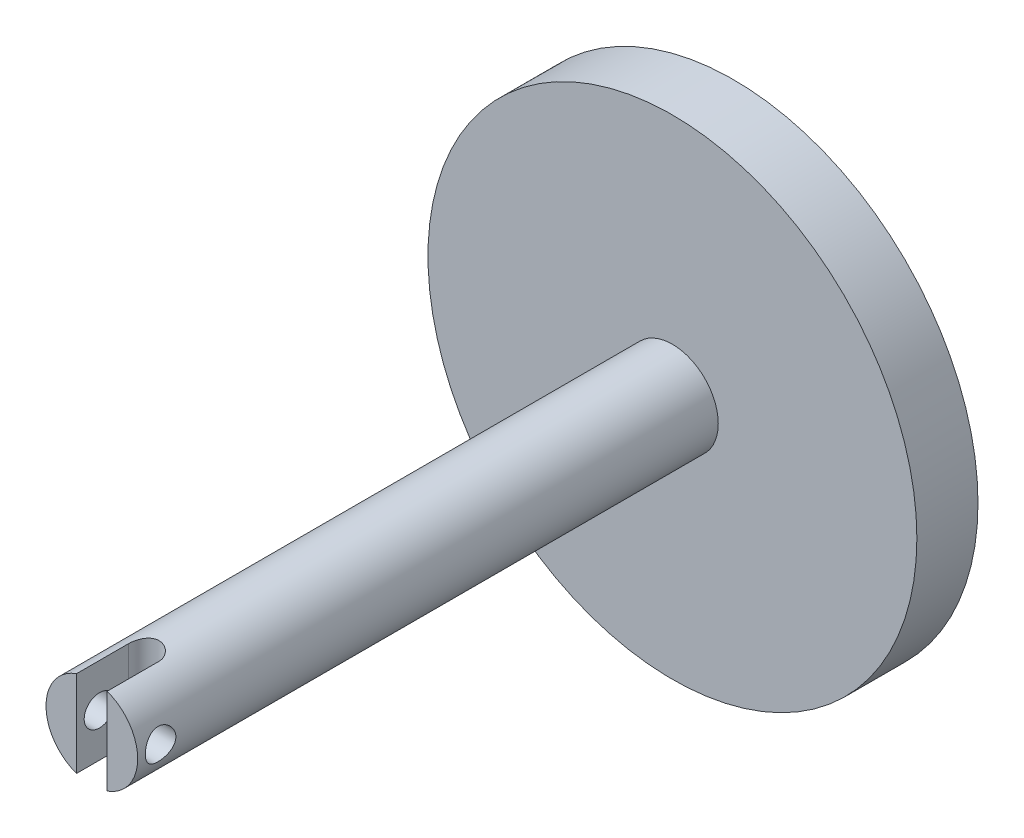
ISO-10303-21;
HEADER;
FILE_DESCRIPTION(('STEP AP214'),'2;1');
FILE_NAME('part.step','',(''),(''),'','','');
FILE_SCHEMA(('AUTOMOTIVE_DESIGN { 1 0 10303 214 1 1 1 1 }'));
ENDSEC;
DATA;
#1=APPLICATION_CONTEXT('core data for automotive mechanical design processes');
#2=APPLICATION_PROTOCOL_DEFINITION('international standard','automotive_design',2000,#1);
#3=PRODUCT_CONTEXT('',#1,'mechanical');
#4=PRODUCT('Part','Part','',(#3));
#5=PRODUCT_RELATED_PRODUCT_CATEGORY('part','',(#4));
#6=PRODUCT_DEFINITION_FORMATION('','',#4);
#7=PRODUCT_DEFINITION_CONTEXT('part definition',#1,'design');
#8=PRODUCT_DEFINITION('design','',#6,#7);
#9=PRODUCT_DEFINITION_SHAPE('','',#8);
#10=(LENGTH_UNIT() NAMED_UNIT(*) SI_UNIT(.MILLI.,.METRE.));
#11=(NAMED_UNIT(*) PLANE_ANGLE_UNIT() SI_UNIT($,.RADIAN.));
#12=(NAMED_UNIT(*) SI_UNIT($,.STERADIAN.) SOLID_ANGLE_UNIT());
#13=UNCERTAINTY_MEASURE_WITH_UNIT(LENGTH_MEASURE(1.E-05),#10,'distance_accuracy_value','');
#14=(GEOMETRIC_REPRESENTATION_CONTEXT(3) GLOBAL_UNCERTAINTY_ASSIGNED_CONTEXT((#13)) GLOBAL_UNIT_ASSIGNED_CONTEXT((#10,
#11,#12)) REPRESENTATION_CONTEXT('',''));
#15=CARTESIAN_POINT('',(0.,0.,0.));
#16=DIRECTION('',(0.,0.,1.));
#17=DIRECTION('',(1.,0.,0.));
#18=AXIS2_PLACEMENT_3D('',#15,#16,#17);
#19=CARTESIAN_POINT('',(0.,0.,105.));
#20=DIRECTION('',(0.,0.,-1.));
#21=DIRECTION('',(-1.,0.,0.));
#22=AXIS2_PLACEMENT_3D('',#19,#20,#21);
#23=CYLINDRICAL_SURFACE('',#22,7.5);
#24=CARTESIAN_POINT('',(0.,0.,105.));
#25=DIRECTION('',(0.,0.,1.));
#26=DIRECTION('',(1.,0.,0.));
#27=AXIS2_PLACEMENT_3D('',#24,#25,#26);
#28=CIRCLE('',#27,7.5);
#29=CARTESIAN_POINT('',(2.5,-7.07106781186548,105.));
#30=VERTEX_POINT('',#29);
#31=CARTESIAN_POINT('',(2.5,7.07106781186548,105.));
#32=VERTEX_POINT('',#31);
#33=EDGE_CURVE('E306',#30,#32,#28,.T.);
#34=ORIENTED_EDGE('',*,*,#33,.F.);
#35=DIRECTION('',(0.,0.,-1.));
#36=VECTOR('',#35,1.);
#37=CARTESIAN_POINT('',(2.5,-7.07106781186548,105.));
#38=LINE('',#37,#36);
#39=CARTESIAN_POINT('',(2.5,-7.07106781186548,96.5));
#40=VERTEX_POINT('',#39);
#41=EDGE_CURVE('E96',#30,#40,#38,.T.);
#42=ORIENTED_EDGE('',*,*,#41,.T.);
#43=CARTESIAN_POINT('',(2.5,-7.07106781186548,96.5));
#44=CARTESIAN_POINT('',(2.50000899110405,-7.07105693273157,96.4317929221797));
#45=CARTESIAN_POINT('',(2.49720887221585,-7.07205443904569,96.3635919253246));
#46=CARTESIAN_POINT('',(2.4860604578047,-7.07598524121007,96.2277189616508));
#47=CARTESIAN_POINT('',(2.47771365997202,-7.07891801450642,96.160046857012));
#48=CARTESIAN_POINT('',(2.45557459422795,-7.08662705252507,96.0259095116455));
#49=CARTESIAN_POINT('',(2.44179847763136,-7.09139784850118,95.9594412974491));
#50=CARTESIAN_POINT('',(2.4089418103012,-7.10262619906002,95.8279917314172));
#51=CARTESIAN_POINT('',(2.38986106786032,-7.10908381460331,95.7630104334101));
#52=CARTESIAN_POINT('',(2.32491551306196,-7.13069940793912,95.5710384202854));
#53=CARTESIAN_POINT('',(2.2713141681025,-7.14811243884051,95.44682084253));
#54=CARTESIAN_POINT('',(2.14517784106255,-7.1869703408752,95.2091231885366));
#55=CARTESIAN_POINT('',(2.07263123268532,-7.20841768551077,95.0956497642198));
#56=CARTESIAN_POINT('',(1.90762995846819,-7.25386182389479,94.8782070965292));
#57=CARTESIAN_POINT('',(1.81456284630833,-7.27792189428067,94.7747148572318));
#58=CARTESIAN_POINT('',(1.61247071190513,-7.32534626726038,94.5844828967663));
#59=CARTESIAN_POINT('',(1.50344285413658,-7.34871044533518,94.497746158681));
#60=CARTESIAN_POINT('',(1.26900922493972,-7.39284706096344,94.3413017757375));
#61=CARTESIAN_POINT('',(1.14325025284461,-7.41353593532888,94.2720976922578));
#62=CARTESIAN_POINT('',(0.881073095475287,-7.44924021883279,94.1560192175653));
#63=CARTESIAN_POINT('',(0.744658181225879,-7.46425736081204,94.1091380050743));
#64=CARTESIAN_POINT('',(0.470073371182902,-7.48647677762783,94.0406607237418));
#65=CARTESIAN_POINT('',(0.332129588153738,-7.49393272446142,94.0182418290428));
#66=CARTESIAN_POINT('',(0.0542474216361972,-7.50109021034827,93.9967092432615));
#67=CARTESIAN_POINT('',(-0.0856904786402172,-7.50079359709905,93.9975899990842));
#68=CARTESIAN_POINT('',(-0.357759612692405,-7.49265096581776,94.0221107104005));
#69=CARTESIAN_POINT('',(-0.489981756428175,-7.48510152476447,94.0448565956047));
#70=CARTESIAN_POINT('',(-0.748610161077314,-7.46367401253772,94.1109829959792));
#71=CARTESIAN_POINT('',(-0.875016099077739,-7.44979559044789,94.1543646553253));
#72=CARTESIAN_POINT('',(-1.12038155754035,-7.41689170677793,94.2610534241945));
#73=CARTESIAN_POINT('',(-1.23922126412503,-7.39780094595656,94.3246151128576));
#74=CARTESIAN_POINT('',(-1.46481147275367,-7.35645969200236,94.469649878425));
#75=CARTESIAN_POINT('',(-1.57155867428943,-7.33420833994017,94.5511278276021));
#76=CARTESIAN_POINT('',(-1.77524334927518,-7.28765679856813,94.734177625007));
#77=CARTESIAN_POINT('',(-1.87148402903098,-7.26330946699776,94.8365138590282));
#78=CARTESIAN_POINT('',(-2.04568006205172,-7.21618726182138,95.0561037242864));
#79=CARTESIAN_POINT('',(-2.12362950795974,-7.19341289789386,95.173362156007));
#80=CARTESIAN_POINT('',(-2.26000831398175,-7.15175078440791,95.4217004458843));
#81=CARTESIAN_POINT('',(-2.31813252376915,-7.13292537370586,95.5529587873327));
#82=CARTESIAN_POINT('',(-2.41115057675285,-7.10202742655098,95.8241174439746));
#83=CARTESIAN_POINT('',(-2.4460810901384,-7.08994423522482,95.9640037334303));
#84=CARTESIAN_POINT('',(-2.47914539070206,-7.078413552368,96.17104659187));
#85=CARTESIAN_POINT('',(-2.48696265313778,-7.07566669236505,96.2366034746356));
#86=CARTESIAN_POINT('',(-2.49738654017799,-7.07199258928497,96.3680951959995));
#87=CARTESIAN_POINT('',(-2.49999988848745,-7.0710629982382,96.434029436361));
#88=CARTESIAN_POINT('',(-2.5,-7.07106781186548,96.5));
#89=B_SPLINE_CURVE_WITH_KNOTS('',3,(#43,#44,#45,#46,#47,#48,#49,#50,#51,#52,#53,#54,#55,#56,#57,
#58,#59,#60,#61,#62,#63,#64,#65,#66,#67,#68,#69,#70,#71,#72,#73,#74,#75,#76,#77,#78,#79,#80,#81,
#82,#83,#84,#85,#86,#87,#88),.UNSPECIFIED.,.F.,.F.,(4,2,2,2,2,2,2,2,2,2,2,2,2,2,2,2,2,2,2,2,2,2,
4),(0.,0.204546211838573,0.409037215423635,0.61292442942907,0.816819012805388,1.22401016923255,
1.63145179965522,2.05327864088388,2.47518051341063,2.90809434014448,3.34087579484514,
3.75860278500203,4.17623021758301,4.57747647846033,4.97874498952315,5.38529148746615,
5.79194868153616,6.2177173682682,6.64362337304802,7.07581676501795,7.50732520398793,
7.70536340013573,7.90314555504336),.UNSPECIFIED.);
#90=CARTESIAN_POINT('',(-2.5,-7.07106781186548,96.5));
#91=VERTEX_POINT('',#90);
#92=EDGE_CURVE('E84',#40,#91,#89,.T.);
#93=ORIENTED_EDGE('',*,*,#92,.T.);
#94=DIRECTION('',(0.,0.,-1.));
#95=VECTOR('',#94,1.);
#96=CARTESIAN_POINT('',(-2.5,-7.07106781186548,105.));
#97=LINE('',#96,#95);
#98=CARTESIAN_POINT('',(-2.5,-7.07106781186548,105.));
#99=VERTEX_POINT('',#98);
#100=EDGE_CURVE('E90',#91,#99,#97,.F.);
#101=ORIENTED_EDGE('',*,*,#100,.T.);
#102=CARTESIAN_POINT('',(-2.5,7.07106781186548,105.));
#103=VERTEX_POINT('',#102);
#104=EDGE_CURVE('E301',#103,#99,#28,.T.);
#105=ORIENTED_EDGE('',*,*,#104,.F.);
#106=DIRECTION('',(0.,0.,-1.));
#107=VECTOR('',#106,1.);
#108=CARTESIAN_POINT('',(-2.5,7.07106781186548,105.));
#109=LINE('',#108,#107);
#110=CARTESIAN_POINT('',(-2.5,7.07106781186548,96.5));
#111=VERTEX_POINT('',#110);
#112=EDGE_CURVE('E62',#111,#103,#109,.F.);
#113=ORIENTED_EDGE('',*,*,#112,.F.);
#114=CARTESIAN_POINT('',(2.5,7.07106781186548,96.5));
#115=CARTESIAN_POINT('',(2.50000899110405,7.07105693273157,96.4317929221797));
#116=CARTESIAN_POINT('',(2.49720887221585,7.07205443904569,96.3635919253246));
#117=CARTESIAN_POINT('',(2.4860604578047,7.07598524121007,96.2277189616508));
#118=CARTESIAN_POINT('',(2.47771365997202,7.07891801450642,96.160046857012));
#119=CARTESIAN_POINT('',(2.45557459422795,7.08662705252507,96.0259095116455));
#120=CARTESIAN_POINT('',(2.44179847763136,7.09139784850118,95.9594412974491));
#121=CARTESIAN_POINT('',(2.4089418103012,7.10262619906002,95.8279917314172));
#122=CARTESIAN_POINT('',(2.38986106786032,7.10908381460331,95.7630104334101));
#123=CARTESIAN_POINT('',(2.32491551306196,7.13069940793912,95.5710384202854));
#124=CARTESIAN_POINT('',(2.2713141681025,7.14811243884051,95.44682084253));
#125=CARTESIAN_POINT('',(2.14517784106255,7.1869703408752,95.2091231885366));
#126=CARTESIAN_POINT('',(2.07263123268532,7.20841768551077,95.0956497642198));
#127=CARTESIAN_POINT('',(1.90762995846819,7.25386182389479,94.8782070965292));
#128=CARTESIAN_POINT('',(1.81456284630833,7.27792189428067,94.7747148572318));
#129=CARTESIAN_POINT('',(1.61247071190513,7.32534626726038,94.5844828967663));
#130=CARTESIAN_POINT('',(1.50344285413658,7.34871044533518,94.497746158681));
#131=CARTESIAN_POINT('',(1.26900922493972,7.39284706096344,94.3413017757375));
#132=CARTESIAN_POINT('',(1.14325025284461,7.41353593532888,94.2720976922578));
#133=CARTESIAN_POINT('',(0.881073095475287,7.44924021883279,94.1560192175653));
#134=CARTESIAN_POINT('',(0.744658181225879,7.46425736081204,94.1091380050743));
#135=CARTESIAN_POINT('',(0.470073371182902,7.48647677762783,94.0406607237418));
#136=CARTESIAN_POINT('',(0.332129588153738,7.49393272446142,94.0182418290428));
#137=CARTESIAN_POINT('',(0.0542474216361972,7.50109021034827,93.9967092432615));
#138=CARTESIAN_POINT('',(-0.0856904786402172,7.50079359709905,93.9975899990842));
#139=CARTESIAN_POINT('',(-0.357759612692405,7.49265096581776,94.0221107104005));
#140=CARTESIAN_POINT('',(-0.489981756428175,7.48510152476447,94.0448565956047));
#141=CARTESIAN_POINT('',(-0.748610161077314,7.46367401253772,94.1109829959792));
#142=CARTESIAN_POINT('',(-0.875016099077739,7.44979559044789,94.1543646553253));
#143=CARTESIAN_POINT('',(-1.12038155754035,7.41689170677793,94.2610534241945));
#144=CARTESIAN_POINT('',(-1.23922126412503,7.39780094595656,94.3246151128576));
#145=CARTESIAN_POINT('',(-1.46481147275367,7.35645969200236,94.469649878425));
#146=CARTESIAN_POINT('',(-1.57155867428943,7.33420833994017,94.5511278276021));
#147=CARTESIAN_POINT('',(-1.77524334927518,7.28765679856813,94.734177625007));
#148=CARTESIAN_POINT('',(-1.87148402903098,7.26330946699776,94.8365138590282));
#149=CARTESIAN_POINT('',(-2.04568006205172,7.21618726182138,95.0561037242864));
#150=CARTESIAN_POINT('',(-2.12362950795974,7.19341289789386,95.173362156007));
#151=CARTESIAN_POINT('',(-2.26000831398175,7.15175078440791,95.4217004458843));
#152=CARTESIAN_POINT('',(-2.31813252376915,7.13292537370586,95.5529587873327));
#153=CARTESIAN_POINT('',(-2.41115057675285,7.10202742655098,95.8241174439746));
#154=CARTESIAN_POINT('',(-2.4460810901384,7.08994423522482,95.9640037334303));
#155=CARTESIAN_POINT('',(-2.47914539070206,7.078413552368,96.17104659187));
#156=CARTESIAN_POINT('',(-2.48696265313778,7.07566669236505,96.2366034746356));
#157=CARTESIAN_POINT('',(-2.49738654017799,7.07199258928497,96.3680951959995));
#158=CARTESIAN_POINT('',(-2.49999988848745,7.0710629982382,96.434029436361));
#159=CARTESIAN_POINT('',(-2.5,7.07106781186548,96.5));
#160=B_SPLINE_CURVE_WITH_KNOTS('',3,(#114,#115,#116,#117,#118,#119,#120,#121,#122,#123,#124,
#125,#126,#127,#128,#129,#130,#131,#132,#133,#134,#135,#136,#137,#138,#139,#140,#141,#142,#143,
#144,#145,#146,#147,#148,#149,#150,#151,#152,#153,#154,#155,#156,#157,#158,#159),.UNSPECIFIED.,
.F.,.F.,(4,2,2,2,2,2,2,2,2,2,2,2,2,2,2,2,2,2,2,2,2,2,4),(0.,0.204546211838573,0.409037215423635,
0.61292442942907,0.816819012805388,1.22401016923255,1.63145179965522,2.05327864088388,
2.47518051341063,2.90809434014448,3.34087579484514,3.75860278500203,4.17623021758301,
4.57747647846033,4.97874498952315,5.38529148746615,5.79194868153616,6.2177173682682,
6.64362337304802,7.07581676501795,7.50732520398793,7.70536340013573,7.90314555504336),.UNSPECIFIED.);
#161=CARTESIAN_POINT('',(2.5,7.07106781186548,96.5));
#162=VERTEX_POINT('',#161);
#163=EDGE_CURVE('E49',#162,#111,#160,.T.);
#164=ORIENTED_EDGE('',*,*,#163,.F.);
#165=DIRECTION('',(0.,0.,-1.));
#166=VECTOR('',#165,1.);
#167=CARTESIAN_POINT('',(2.5,7.07106781186548,105.));
#168=LINE('',#167,#166);
#169=EDGE_CURVE('E86',#32,#162,#168,.T.);
#170=ORIENTED_EDGE('',*,*,#169,.F.);
#171=EDGE_LOOP('',(#34,#42,#93,#101,#105,#113,#164,#170));
#172=FACE_BOUND('',#171,.T.);
#173=CARTESIAN_POINT('',(0.,0.,10.));
#174=DIRECTION('',(0.,0.,1.));
#175=DIRECTION('',(1.,0.,0.));
#176=AXIS2_PLACEMENT_3D('',#173,#174,#175);
#177=CIRCLE('',#176,7.5);
#178=CARTESIAN_POINT('',(7.5,0.,10.));
#179=VERTEX_POINT('',#178);
#180=EDGE_CURVE('E310',#179,#179,#177,.T.);
#181=ORIENTED_EDGE('',*,*,#180,.T.);
#182=EDGE_LOOP('',(#181));
#183=FACE_BOUND('',#182,.T.);
#184=CARTESIAN_POINT('',(-7.5,0.,103.75));
#185=CARTESIAN_POINT('',(-7.5000003825236,-0.136408407216808,103.750000634329));
#186=CARTESIAN_POINT('',(-7.49624423768862,-0.272812986346375,103.738799334682));
#187=CARTESIAN_POINT('',(-7.48163025508202,-0.541604402182431,103.694427227957));
#188=CARTESIAN_POINT('',(-7.47077168005381,-0.673990820297045,103.661254140128));
#189=CARTESIAN_POINT('',(-7.44313269766107,-0.930831973754441,103.57420189154));
#190=CARTESIAN_POINT('',(-7.42636219327133,-1.05529956471509,103.520357343852));
#191=CARTESIAN_POINT('',(-7.38861114293355,-1.29343734201331,103.393647067904));
#192=CARTESIAN_POINT('',(-7.36762976669445,-1.40710539239676,103.320777587493));
#193=CARTESIAN_POINT('',(-7.32285236107513,-1.62435418755566,103.155435487853));
#194=CARTESIAN_POINT('',(-7.29898891159462,-1.72750925074577,103.062421914349));
#195=CARTESIAN_POINT('',(-7.25150786957804,-1.91708173175521,102.860582113234));
#196=CARTESIAN_POINT('',(-7.22789033226373,-2.00349546372365,102.751752412679));
#197=CARTESIAN_POINT('',(-7.18283331193184,-2.15956235556965,102.517537212009));
#198=CARTESIAN_POINT('',(-7.1614759818922,-2.22866214555258,102.39176565067));
#199=CARTESIAN_POINT('',(-7.12438263546503,-2.3445471846943,102.129559763854));
#200=CARTESIAN_POINT('',(-7.10864490401864,-2.39133924346691,101.993128707093));
#201=CARTESIAN_POINT('',(-7.08528258173443,-2.4596836537729,101.718316946258));
#202=CARTESIAN_POINT('',(-7.07740239424028,-2.48203362067942,101.580156978777));
#203=CARTESIAN_POINT('',(-7.06989141573769,-2.50335280833619,101.30184061461));
#204=CARTESIAN_POINT('',(-7.07025807556825,-2.50232925401179,101.161684848227));
#205=CARTESIAN_POINT('',(-7.0789753752045,-2.47754975925854,100.89015842389));
#206=CARTESIAN_POINT('',(-7.08696039668832,-2.45483478291748,100.758678992702));
#207=CARTESIAN_POINT('',(-7.10941644311377,-2.38901540712353,100.501516450983));
#208=CARTESIAN_POINT('',(-7.12388824460269,-2.34590856647967,100.375834036412));
#209=CARTESIAN_POINT('',(-7.15794777828122,-2.23984764515052,100.131468126021));
#210=CARTESIAN_POINT('',(-7.17761414482794,-2.17658512176815,100.012929936326));
#211=CARTESIAN_POINT('',(-7.21981396439316,-2.03222276575783,99.7878227293007));
#212=CARTESIAN_POINT('',(-7.24234824476159,-1.95111778091,99.6812571826665));
#213=CARTESIAN_POINT('',(-7.28918322919353,-1.76837333170558,99.4772710045981));
#214=CARTESIAN_POINT('',(-7.31351473387107,-1.66588287519076,99.3806182637273));
#215=CARTESIAN_POINT('',(-7.36017345967592,-1.44584892492515,99.2056718333415));
#216=CARTESIAN_POINT('',(-7.38250048845168,-1.32830398915203,99.1273799045888));
#217=CARTESIAN_POINT('',(-7.42292769844484,-1.07986903261567,98.9907592494123));
#218=CARTESIAN_POINT('',(-7.44098375020098,-0.948858191040841,98.9326362716482));
#219=CARTESIAN_POINT('',(-7.47051417861087,-0.678172708411268,98.8394920651107));
#220=CARTESIAN_POINT('',(-7.48199084137198,-0.538501095387383,98.8044628114414));
#221=CARTESIAN_POINT('',(-7.49669067678601,-0.260959573823258,98.7598608349441));
#222=CARTESIAN_POINT('',(-7.5002500458432,-0.123273999662114,98.7492504770681));
#223=CARTESIAN_POINT('',(-7.49972256737068,0.151937674900594,98.7508316839962));
#224=CARTESIAN_POINT('',(-7.49563701048406,0.289463798299127,98.7630193999497));
#225=CARTESIAN_POINT('',(-7.48050061792761,0.556299665760638,98.8090297693399));
#226=CARTESIAN_POINT('',(-7.46965496777981,0.685732017087106,98.8422155151237));
#227=CARTESIAN_POINT('',(-7.44229617075175,0.937139896448931,98.9284836111668));
#228=CARTESIAN_POINT('',(-7.42578230116688,1.05911447127151,98.9815684986695));
#229=CARTESIAN_POINT('',(-7.38822328218224,1.29572074098318,99.107676079602));
#230=CARTESIAN_POINT('',(-7.36707036889465,1.41007489804286,99.1811864832079));
#231=CARTESIAN_POINT('',(-7.32263134790656,1.62516207533896,99.3454853750337));
#232=CARTESIAN_POINT('',(-7.29934458984569,1.72589091948894,99.4362791400794));
#233=CARTESIAN_POINT('',(-7.25192119951112,1.91563126951575,99.6374468775165));
#234=CARTESIAN_POINT('',(-7.2277940271857,2.00390242311442,99.7485230673171));
#235=CARTESIAN_POINT('',(-7.18249933236772,2.16064380580893,99.9844289195272));
#236=CARTESIAN_POINT('',(-7.16133183455006,2.22911386982753,100.109258696585));
#237=CARTESIAN_POINT('',(-7.12455979478459,2.3439923260409,100.369182538225));
#238=CARTESIAN_POINT('',(-7.10894401982447,2.39044533041255,100.504255197922));
#239=CARTESIAN_POINT('',(-7.08527080766124,2.45973666689838,100.78094662511));
#240=CARTESIAN_POINT('',(-7.07720996559099,2.48258563738484,100.922562413511));
#241=CARTESIAN_POINT('',(-7.06994647185443,2.50319070619335,101.200492740102));
#242=CARTESIAN_POINT('',(-7.07031000643538,2.50217564327099,101.336705850717));
#243=CARTESIAN_POINT('',(-7.07878174559669,2.47810573362173,101.606912687305));
#244=CARTESIAN_POINT('',(-7.08688948923404,2.45505219864646,101.740906544888));
#245=CARTESIAN_POINT('',(-7.10961310762229,2.38842953282336,102.000339157506));
#246=CARTESIAN_POINT('',(-7.12410245056194,2.34525836503878,102.125892062511));
#247=CARTESIAN_POINT('',(-7.15790997046171,2.23994841439936,102.368068517346));
#248=CARTESIAN_POINT('',(-7.17722921908483,2.1778054213845,102.48469007797));
#249=CARTESIAN_POINT('',(-7.21957073065116,2.03315173145856,102.711209174807));
#250=CARTESIAN_POINT('',(-7.24271779105343,1.94987060691144,102.820591254746));
#251=CARTESIAN_POINT('',(-7.28958390708132,1.76660720783912,103.02422453346));
#252=CARTESIAN_POINT('',(-7.31330312280931,1.6666202111287,103.11847143922));
#253=CARTESIAN_POINT('',(-7.35975076313861,1.44810389230172,103.292861030723));
#254=CARTESIAN_POINT('',(-7.38240454503142,1.32900378374932,103.372310869377));
#255=CARTESIAN_POINT('',(-7.4231497793153,1.07839339351656,103.509976072127));
#256=CARTESIAN_POINT('',(-7.44124239769824,0.946886295330871,103.568196864805));
#257=CARTESIAN_POINT('',(-7.47013787671355,0.681234118002441,103.659304081222));
#258=CARTESIAN_POINT('',(-7.48123031056307,0.547469394191023,103.693206165658));
#259=CARTESIAN_POINT('',(-7.49616017660554,0.275801040025618,103.738550701693));
#260=CARTESIAN_POINT('',(-7.49999961329762,0.137898563921866,103.749999358741));
#261=CARTESIAN_POINT('',(-7.5,0.,103.75));
#262=B_SPLINE_CURVE_WITH_KNOTS('',3,(#184,#185,#186,#187,#188,#189,#190,#191,#192,#193,#194,
#195,#196,#197,#198,#199,#200,#201,#202,#203,#204,#205,#206,#207,#208,#209,#210,#211,#212,#213,
#214,#215,#216,#217,#218,#219,#220,#221,#222,#223,#224,#225,#226,#227,#228,#229,#230,#231,#232,
#233,#234,#235,#236,#237,#238,#239,#240,#241,#242,#243,#244,#245,#246,#247,#248,#249,#250,#251,
#252,#253,#254,#255,#256,#257,#258,#259,#260,#261),.UNSPECIFIED.,.T.,.F.,(4,2,2,2,2,2,2,2,2,2,2,
2,2,2,2,2,2,2,2,2,2,2,2,2,2,2,2,2,2,2,2,2,2,2,2,2,2,2,4),(0.,0.408717765065027,0.8174779631688,
1.22555668217569,1.63371594449774,2.0546171070689,2.47561083218825,2.90870962058678,
3.34167611732082,3.76004814354599,4.17829084968712,4.57742066378199,4.97659827138705,
5.38220427887827,5.78792756395518,6.21483264528416,6.64177864916544,7.07296014125892,
7.50399172193019,7.91633957937922,8.32861782910439,8.72895394945531,9.12934113210257,
9.54025999609339,9.95130452054726,10.3810255720188,10.8107502058749,11.2396003456692,
11.668257117646,12.0748916516064,12.4815019837843,12.8803896770104,13.2793659543994,
13.6957516672951,14.1122552780944,14.5449915208775,14.9776170288114,15.3909139593453,
15.8040966509535),.UNSPECIFIED.);
#263=CARTESIAN_POINT('',(-7.5,0.,103.75));
#264=VERTEX_POINT('',#263);
#265=EDGE_CURVE('E97',#264,#264,#262,.T.);
#266=ORIENTED_EDGE('',*,*,#265,.T.);
#267=EDGE_LOOP('',(#266));
#268=FACE_BOUND('',#267,.T.);
#269=CARTESIAN_POINT('',(7.5,0.,103.75));
#270=CARTESIAN_POINT('',(7.5000003825236,-0.136408407216808,103.750000634329));
#271=CARTESIAN_POINT('',(7.49624423768862,-0.272812986346375,103.738799334682));
#272=CARTESIAN_POINT('',(7.48163025508202,-0.541604402182431,103.694427227957));
#273=CARTESIAN_POINT('',(7.47077168005381,-0.673990820297045,103.661254140128));
#274=CARTESIAN_POINT('',(7.44313269766107,-0.930831973754441,103.57420189154));
#275=CARTESIAN_POINT('',(7.42636219327133,-1.05529956471509,103.520357343852));
#276=CARTESIAN_POINT('',(7.38861114293355,-1.29343734201331,103.393647067904));
#277=CARTESIAN_POINT('',(7.36762976669445,-1.40710539239676,103.320777587493));
#278=CARTESIAN_POINT('',(7.32285236107513,-1.62435418755566,103.155435487853));
#279=CARTESIAN_POINT('',(7.29898891159462,-1.72750925074577,103.062421914349));
#280=CARTESIAN_POINT('',(7.25150786957804,-1.91708173175521,102.860582113234));
#281=CARTESIAN_POINT('',(7.22789033226373,-2.00349546372365,102.751752412679));
#282=CARTESIAN_POINT('',(7.18283331193184,-2.15956235556965,102.517537212009));
#283=CARTESIAN_POINT('',(7.1614759818922,-2.22866214555258,102.39176565067));
#284=CARTESIAN_POINT('',(7.12438263546503,-2.3445471846943,102.129559763854));
#285=CARTESIAN_POINT('',(7.10864490401864,-2.39133924346691,101.993128707093));
#286=CARTESIAN_POINT('',(7.08528258173443,-2.4596836537729,101.718316946258));
#287=CARTESIAN_POINT('',(7.07740239424028,-2.48203362067942,101.580156978777));
#288=CARTESIAN_POINT('',(7.06989141573769,-2.50335280833619,101.30184061461));
#289=CARTESIAN_POINT('',(7.07025807556825,-2.50232925401179,101.161684848227));
#290=CARTESIAN_POINT('',(7.0789753752045,-2.47754975925854,100.89015842389));
#291=CARTESIAN_POINT('',(7.08696039668832,-2.45483478291748,100.758678992702));
#292=CARTESIAN_POINT('',(7.10941644311377,-2.38901540712353,100.501516450983));
#293=CARTESIAN_POINT('',(7.12388824460269,-2.34590856647967,100.375834036412));
#294=CARTESIAN_POINT('',(7.15794777828122,-2.23984764515052,100.131468126021));
#295=CARTESIAN_POINT('',(7.17761414482794,-2.17658512176815,100.012929936326));
#296=CARTESIAN_POINT('',(7.21981396439316,-2.03222276575783,99.7878227293007));
#297=CARTESIAN_POINT('',(7.24234824476159,-1.95111778091,99.6812571826665));
#298=CARTESIAN_POINT('',(7.28918322919353,-1.76837333170558,99.4772710045981));
#299=CARTESIAN_POINT('',(7.31351473387107,-1.66588287519076,99.3806182637273));
#300=CARTESIAN_POINT('',(7.36017345967592,-1.44584892492515,99.2056718333415));
#301=CARTESIAN_POINT('',(7.38250048845168,-1.32830398915203,99.1273799045888));
#302=CARTESIAN_POINT('',(7.42292769844484,-1.07986903261567,98.9907592494123));
#303=CARTESIAN_POINT('',(7.44098375020098,-0.948858191040841,98.9326362716482));
#304=CARTESIAN_POINT('',(7.47051417861087,-0.678172708411268,98.8394920651107));
#305=CARTESIAN_POINT('',(7.48199084137198,-0.538501095387383,98.8044628114414));
#306=CARTESIAN_POINT('',(7.49669067678601,-0.260959573823258,98.7598608349441));
#307=CARTESIAN_POINT('',(7.5002500458432,-0.123273999662114,98.7492504770681));
#308=CARTESIAN_POINT('',(7.49972256737068,0.151937674900594,98.7508316839962));
#309=CARTESIAN_POINT('',(7.49563701048406,0.289463798299127,98.7630193999497));
#310=CARTESIAN_POINT('',(7.48050061792761,0.556299665760638,98.8090297693399));
#311=CARTESIAN_POINT('',(7.46965496777981,0.685732017087106,98.8422155151237));
#312=CARTESIAN_POINT('',(7.44229617075175,0.937139896448931,98.9284836111668));
#313=CARTESIAN_POINT('',(7.42578230116688,1.05911447127151,98.9815684986695));
#314=CARTESIAN_POINT('',(7.38822328218224,1.29572074098318,99.107676079602));
#315=CARTESIAN_POINT('',(7.36707036889465,1.41007489804286,99.1811864832079));
#316=CARTESIAN_POINT('',(7.32263134790656,1.62516207533896,99.3454853750337));
#317=CARTESIAN_POINT('',(7.29934458984569,1.72589091948894,99.4362791400794));
#318=CARTESIAN_POINT('',(7.25192119951112,1.91563126951575,99.6374468775165));
#319=CARTESIAN_POINT('',(7.2277940271857,2.00390242311442,99.7485230673171));
#320=CARTESIAN_POINT('',(7.18249933236772,2.16064380580893,99.9844289195272));
#321=CARTESIAN_POINT('',(7.16133183455006,2.22911386982753,100.109258696585));
#322=CARTESIAN_POINT('',(7.12455979478459,2.3439923260409,100.369182538225));
#323=CARTESIAN_POINT('',(7.10894401982447,2.39044533041255,100.504255197922));
#324=CARTESIAN_POINT('',(7.08527080766124,2.45973666689838,100.78094662511));
#325=CARTESIAN_POINT('',(7.07720996559099,2.48258563738484,100.922562413511));
#326=CARTESIAN_POINT('',(7.06994647185443,2.50319070619335,101.200492740102));
#327=CARTESIAN_POINT('',(7.07031000643538,2.50217564327099,101.336705850717));
#328=CARTESIAN_POINT('',(7.07878174559669,2.47810573362173,101.606912687305));
#329=CARTESIAN_POINT('',(7.08688948923404,2.45505219864646,101.740906544888));
#330=CARTESIAN_POINT('',(7.10961310762229,2.38842953282336,102.000339157506));
#331=CARTESIAN_POINT('',(7.12410245056194,2.34525836503878,102.125892062511));
#332=CARTESIAN_POINT('',(7.15790997046171,2.23994841439936,102.368068517346));
#333=CARTESIAN_POINT('',(7.17722921908483,2.1778054213845,102.48469007797));
#334=CARTESIAN_POINT('',(7.21957073065116,2.03315173145856,102.711209174807));
#335=CARTESIAN_POINT('',(7.24271779105343,1.94987060691144,102.820591254746));
#336=CARTESIAN_POINT('',(7.28958390708132,1.76660720783912,103.02422453346));
#337=CARTESIAN_POINT('',(7.31330312280931,1.6666202111287,103.11847143922));
#338=CARTESIAN_POINT('',(7.35975076313861,1.44810389230172,103.292861030723));
#339=CARTESIAN_POINT('',(7.38240454503142,1.32900378374932,103.372310869377));
#340=CARTESIAN_POINT('',(7.4231497793153,1.07839339351656,103.509976072127));
#341=CARTESIAN_POINT('',(7.44124239769824,0.946886295330871,103.568196864805));
#342=CARTESIAN_POINT('',(7.47013787671355,0.681234118002441,103.659304081222));
#343=CARTESIAN_POINT('',(7.48123031056307,0.547469394191023,103.693206165658));
#344=CARTESIAN_POINT('',(7.49616017660554,0.275801040025618,103.738550701693));
#345=CARTESIAN_POINT('',(7.49999961329762,0.137898563921866,103.749999358741));
#346=CARTESIAN_POINT('',(7.5,0.,103.75));
#347=B_SPLINE_CURVE_WITH_KNOTS('',3,(#269,#270,#271,#272,#273,#274,#275,#276,#277,#278,#279,
#280,#281,#282,#283,#284,#285,#286,#287,#288,#289,#290,#291,#292,#293,#294,#295,#296,#297,#298,
#299,#300,#301,#302,#303,#304,#305,#306,#307,#308,#309,#310,#311,#312,#313,#314,#315,#316,#317,
#318,#319,#320,#321,#322,#323,#324,#325,#326,#327,#328,#329,#330,#331,#332,#333,#334,#335,#336,
#337,#338,#339,#340,#341,#342,#343,#344,#345,#346),.UNSPECIFIED.,.T.,.F.,(4,2,2,2,2,2,2,2,2,2,2,
2,2,2,2,2,2,2,2,2,2,2,2,2,2,2,2,2,2,2,2,2,2,2,2,2,2,2,4),(0.,0.408717765065027,0.8174779631688,
1.22555668217569,1.63371594449774,2.0546171070689,2.47561083218825,2.90870962058678,
3.34167611732082,3.76004814354599,4.17829084968712,4.57742066378199,4.97659827138705,
5.38220427887827,5.78792756395518,6.21483264528416,6.64177864916544,7.07296014125892,
7.50399172193019,7.91633957937922,8.32861782910439,8.72895394945531,9.12934113210257,
9.54025999609339,9.95130452054726,10.3810255720188,10.8107502058749,11.2396003456692,
11.668257117646,12.0748916516064,12.4815019837843,12.8803896770104,13.2793659543994,
13.6957516672951,14.1122552780944,14.5449915208775,14.9776170288114,15.3909139593453,
15.8040966509535),.UNSPECIFIED.);
#348=CARTESIAN_POINT('',(7.5,0.,103.75));
#349=VERTEX_POINT('',#348);
#350=EDGE_CURVE('E140',#349,#349,#347,.T.);
#351=ORIENTED_EDGE('',*,*,#350,.F.);
#352=EDGE_LOOP('',(#351));
#353=FACE_BOUND('',#352,.T.);
#354=ADVANCED_FACE('F37',(#172,#183,#268,#353),#23,.T.);
#355=CARTESIAN_POINT('',(2.5,40.,105.));
#356=DIRECTION('',(-1.,0.,0.));
#357=DIRECTION('',(0.,0.,1.));
#358=AXIS2_PLACEMENT_3D('',#355,#356,#357);
#359=PLANE('',#358);
#360=ORIENTED_EDGE('',*,*,#169,.T.);
#361=DIRECTION('',(0.,-1.,0.));
#362=VECTOR('',#361,1.);
#363=CARTESIAN_POINT('',(2.5,40.,96.5));
#364=LINE('',#363,#362);
#365=EDGE_CURVE('E87',#162,#40,#364,.T.);
#366=ORIENTED_EDGE('',*,*,#365,.T.);
#367=ORIENTED_EDGE('',*,*,#41,.F.);
#368=DIRECTION('',(0.,-1.,0.));
#369=VECTOR('',#368,1.);
#370=CARTESIAN_POINT('',(2.5,0.,105.));
#371=LINE('',#370,#369);
#372=EDGE_CURVE('E315',#32,#30,#371,.T.);
#373=ORIENTED_EDGE('',*,*,#372,.F.);
#374=EDGE_LOOP('',(#360,#366,#367,#373));
#375=FACE_BOUND('',#374,.T.);
#376=CARTESIAN_POINT('',(2.5,0.,101.25));
#377=DIRECTION('',(-1.,0.,0.));
#378=DIRECTION('',(0.,0.,1.));
#379=AXIS2_PLACEMENT_3D('',#376,#377,#378);
#380=CIRCLE('',#379,2.49999999999999);
#381=CARTESIAN_POINT('',(2.5,0.,103.75));
#382=VERTEX_POINT('',#381);
#383=EDGE_CURVE('E141',#382,#382,#380,.F.);
#384=ORIENTED_EDGE('',*,*,#383,.T.);
#385=EDGE_LOOP('',(#384));
#386=FACE_BOUND('',#385,.T.);
#387=ADVANCED_FACE('F119',(#375,#386),#359,.T.);
#388=CARTESIAN_POINT('',(0.,0.,105.));
#389=DIRECTION('',(0.,0.,1.));
#390=DIRECTION('',(1.,0.,0.));
#391=AXIS2_PLACEMENT_3D('',#388,#389,#390);
#392=PLANE('',#391);
#393=ORIENTED_EDGE('',*,*,#372,.T.);
#394=ORIENTED_EDGE('',*,*,#33,.T.);
#395=EDGE_LOOP('',(#393,#394));
#396=FACE_BOUND('',#395,.T.);
#397=ADVANCED_FACE('F122',(#396),#392,.T.);
#398=ORIENTED_EDGE('',*,*,#104,.T.);
#399=DIRECTION('',(0.,1.,0.));
#400=VECTOR('',#399,1.);
#401=CARTESIAN_POINT('',(-2.5,0.,105.));
#402=LINE('',#401,#400);
#403=EDGE_CURVE('E92',#99,#103,#402,.T.);
#404=ORIENTED_EDGE('',*,*,#403,.T.);
#405=EDGE_LOOP('',(#398,#404));
#406=FACE_BOUND('',#405,.T.);
#407=ADVANCED_FACE('F130',(#406),#392,.T.);
#408=CARTESIAN_POINT('',(0.,0.,10.));
#409=DIRECTION('',(0.,0.,1.));
#410=DIRECTION('',(1.,0.,0.));
#411=AXIS2_PLACEMENT_3D('',#408,#409,#410);
#412=PLANE('',#411);
#413=CARTESIAN_POINT('',(0.,0.,10.));
#414=DIRECTION('',(0.,0.,1.));
#415=DIRECTION('',(1.,0.,0.));
#416=AXIS2_PLACEMENT_3D('',#413,#414,#415);
#417=CIRCLE('',#416,40.);
#418=CARTESIAN_POINT('',(40.,0.,10.));
#419=VERTEX_POINT('',#418);
#420=EDGE_CURVE('E304',#419,#419,#417,.T.);
#421=ORIENTED_EDGE('',*,*,#420,.T.);
#422=EDGE_LOOP('',(#421));
#423=FACE_BOUND('',#422,.T.);
#424=ORIENTED_EDGE('',*,*,#180,.F.);
#425=EDGE_LOOP('',(#424));
#426=FACE_BOUND('',#425,.T.);
#427=ADVANCED_FACE('F192',(#423,#426),#412,.T.);
#428=CARTESIAN_POINT('',(0.,0.,0.));
#429=DIRECTION('',(0.,0.,1.));
#430=DIRECTION('',(1.,0.,0.));
#431=AXIS2_PLACEMENT_3D('',#428,#429,#430);
#432=PLANE('',#431);
#433=CARTESIAN_POINT('',(0.,0.,0.));
#434=DIRECTION('',(0.,0.,1.));
#435=DIRECTION('',(1.,0.,0.));
#436=AXIS2_PLACEMENT_3D('',#433,#434,#435);
#437=CIRCLE('',#436,40.);
#438=CARTESIAN_POINT('',(40.,0.,0.));
#439=VERTEX_POINT('',#438);
#440=EDGE_CURVE('E300',#439,#439,#437,.T.);
#441=ORIENTED_EDGE('',*,*,#440,.F.);
#442=EDGE_LOOP('',(#441));
#443=FACE_BOUND('',#442,.T.);
#444=CARTESIAN_POINT('',(0.,0.,0.));
#445=DIRECTION('',(0.,0.,1.));
#446=DIRECTION('',(1.,0.,0.));
#447=AXIS2_PLACEMENT_3D('',#444,#445,#446);
#448=CIRCLE('',#447,15.);
#449=CARTESIAN_POINT('',(15.,0.,0.));
#450=VERTEX_POINT('',#449);
#451=EDGE_CURVE('E312',#450,#450,#448,.F.);
#452=ORIENTED_EDGE('',*,*,#451,.F.);
#453=EDGE_LOOP('',(#452));
#454=FACE_BOUND('',#453,.T.);
#455=ADVANCED_FACE('F199',(#443,#454),#432,.F.);
#456=CARTESIAN_POINT('',(0.,0.,10.));
#457=DIRECTION('',(0.,0.,-1.));
#458=DIRECTION('',(-1.,0.,0.));
#459=AXIS2_PLACEMENT_3D('',#456,#457,#458);
#460=CYLINDRICAL_SURFACE('',#459,40.);
#461=CARTESIAN_POINT('',(-40.,0.,3.5));
#462=CARTESIAN_POINT('',(-39.9999996219072,0.0842238941997645,3.50000372517053));
#463=CARTESIAN_POINT('',(-39.9997311353796,0.168508104609558,3.50711747954199));
#464=CARTESIAN_POINT('',(-39.998685900162,0.334753116085229,3.53539572050133));
#465=CARTESIAN_POINT('',(-39.9979085469819,0.416711032748489,3.55657691844668));
#466=CARTESIAN_POINT('',(-39.9959335958683,0.575871067357669,3.61238426524862));
#467=CARTESIAN_POINT('',(-39.9947362062658,0.653075520666556,3.64700374984966));
#468=CARTESIAN_POINT('',(-39.992056179409,0.800555741826295,3.72869517128443));
#469=CARTESIAN_POINT('',(-39.9905736110833,0.87083317776042,3.7757641000831));
#470=CARTESIAN_POINT('',(-39.987489065982,1.00253022352083,3.88105226041963));
#471=CARTESIAN_POINT('',(-39.9858870247672,1.06394499996802,3.93927753624458));
#472=CARTESIAN_POINT('',(-39.9827446565214,1.17613246116102,4.06521426578594));
#473=CARTESIAN_POINT('',(-39.98120433197,1.22690471867317,4.13292610014912));
#474=CARTESIAN_POINT('',(-39.9783587057133,1.3163763957927,4.2759355735887));
#475=CARTESIAN_POINT('',(-39.9770534691483,1.35507247139223,4.35123530620254));
#476=CARTESIAN_POINT('',(-39.9748258964957,1.41927175917649,4.5072682679114));
#477=CARTESIAN_POINT('',(-39.9739035584399,1.44477503917835,4.58800146907344));
#478=CARTESIAN_POINT('',(-39.9725463139317,1.48185319155903,4.75256908006943));
#479=CARTESIAN_POINT('',(-39.9721111764104,1.49343466694721,4.83640200026628));
#480=CARTESIAN_POINT('',(-39.9717767041903,1.50236081095973,5.0048231448201));
#481=CARTESIAN_POINT('',(-39.9718773666919,1.49970555397062,5.08941136522833));
#482=CARTESIAN_POINT('',(-39.9726029279944,1.48023914595301,5.25689714918202));
#483=CARTESIAN_POINT('',(-39.9732275626572,1.46343512739824,5.33979554301753));
#484=CARTESIAN_POINT('',(-39.9749302414853,1.41615924228432,5.5015939423534));
#485=CARTESIAN_POINT('',(-39.97600828694,1.38568733685979,5.58049393648337));
#486=CARTESIAN_POINT('',(-39.9784965722576,1.31193248757256,5.7320788360908));
#487=CARTESIAN_POINT('',(-39.979906896737,1.26864627976039,5.80476215202228));
#488=CARTESIAN_POINT('',(-39.9829006757514,1.17049396470032,5.94183306950233));
#489=CARTESIAN_POINT('',(-39.9844841309434,1.11562781349477,6.00622063955862));
#490=CARTESIAN_POINT('',(-39.9876468541265,0.995832746765797,6.12491387170903));
#491=CARTESIAN_POINT('',(-39.9892261189354,0.930897650125,6.17921329558733));
#492=CARTESIAN_POINT('',(-39.9922014995717,0.792829738133773,6.27614083181805));
#493=CARTESIAN_POINT('',(-39.9935976153653,0.719696921268663,6.31876894201397));
#494=CARTESIAN_POINT('',(-39.9960493612399,0.567306014960865,6.39114313075465));
#495=CARTESIAN_POINT('',(-39.9971049859539,0.48804782899166,6.42088900624615));
#496=CARTESIAN_POINT('',(-39.9987566785932,0.325657613715305,6.46665033591174));
#497=CARTESIAN_POINT('',(-39.999352748462,0.242525600791471,6.48266584814918));
#498=CARTESIAN_POINT('',(-40.0000178950936,0.0748017376817339,6.50050417095259));
#499=CARTESIAN_POINT('',(-40.0000872923327,-0.00978919334752177,6.50233561243031));
#500=CARTESIAN_POINT('',(-39.9996921210583,-0.178077272041203,6.49177630785297));
#501=CARTESIAN_POINT('',(-39.9992275535259,-0.261774421347711,6.47938558793184));
#502=CARTESIAN_POINT('',(-39.9978170062601,-0.425874979088391,6.44074083101335));
#503=CARTESIAN_POINT('',(-39.9968711628581,-0.506279313315212,6.41449071989599));
#504=CARTESIAN_POINT('',(-39.9946046162768,-0.661540312203192,6.34887630644243));
#505=CARTESIAN_POINT('',(-39.9932839118975,-0.73639695910317,6.30951196212262));
#506=CARTESIAN_POINT('',(-39.9904155580209,-0.878477374856989,6.21876430584688));
#507=CARTESIAN_POINT('',(-39.9888677991112,-0.945697435945938,6.16737519228165));
#508=CARTESIAN_POINT('',(-39.9857200947345,-1.07055929730689,6.05404525095124));
#509=CARTESIAN_POINT('',(-39.9841201490708,-1.12820106145046,5.99210438338763));
#510=CARTESIAN_POINT('',(-39.981047514804,-1.23229899094946,5.8593921746236));
#511=CARTESIAN_POINT('',(-39.9795748898421,-1.27874958288799,5.78861646002744));
#512=CARTESIAN_POINT('',(-39.9769239370764,-1.35910851588215,5.64026584819569));
#513=CARTESIAN_POINT('',(-39.9757456084131,-1.39301689357114,5.56269097081994));
#514=CARTESIAN_POINT('',(-39.9738165630305,-1.44731910622159,5.40296497660435));
#515=CARTESIAN_POINT('',(-39.9730657327578,-1.4677165302416,5.32081508136625));
#516=CARTESIAN_POINT('',(-39.972076023443,-1.49442958232369,5.15425376397574));
#517=CARTESIAN_POINT('',(-39.9718371431754,-1.50074524409723,5.06984234723785));
#518=CARTESIAN_POINT('',(-39.971898308574,-1.4991150894825,4.90120973987907));
#519=CARTESIAN_POINT('',(-39.9721980225065,-1.49117805169431,4.81698846413397));
#520=CARTESIAN_POINT('',(-39.973301892506,-1.46128589358193,4.65107483677118));
#521=CARTESIAN_POINT('',(-39.9741060495624,-1.43933074575892,4.56938249011472));
#522=CARTESIAN_POINT('',(-39.9761280956741,-1.38202710493796,4.41084308467412));
#523=CARTESIAN_POINT('',(-39.9773459907542,-1.34667841690408,4.33399609646681));
#524=CARTESIAN_POINT('',(-39.9800581792354,-1.26359329489459,4.18732828305495));
#525=CARTESIAN_POINT('',(-39.9815524631212,-1.2158572873572,4.11750721609517));
#526=CARTESIAN_POINT('',(-39.9846499851657,-1.10932356414539,3.98683089157973));
#527=CARTESIAN_POINT('',(-39.9862532783689,-1.05052023310424,3.92598021351521));
#528=CARTESIAN_POINT('',(-39.9893879105197,-0.923515334461145,3.81499708233691));
#529=CARTESIAN_POINT('',(-39.9909192315897,-0.85531144816256,3.76486728139227));
#530=CARTESIAN_POINT('',(-39.9937380173353,-0.711406385347882,3.67673571290081));
#531=CARTESIAN_POINT('',(-39.9950252993796,-0.635699657950657,3.63874301393253));
#532=CARTESIAN_POINT('',(-39.9972078636236,-0.479035134579975,3.57605207965012));
#533=CARTESIAN_POINT('',(-39.9981036116322,-0.39808371067532,3.55133803861356));
#534=CARTESIAN_POINT('',(-39.9991635563453,-0.263852959419219,3.5224342853618));
#535=CARTESIAN_POINT('',(-39.9994758562069,-0.21144433967318,3.51403206285329));
#536=CARTESIAN_POINT('',(-39.9998941970109,-0.10603178294933,3.50281374878088));
#537=CARTESIAN_POINT('',(-40.0000002380494,-0.0530278462492198,3.4999976546113));
#538=CARTESIAN_POINT('',(-40.,0.,3.5));
#539=B_SPLINE_CURVE_WITH_KNOTS('',3,(#461,#462,#463,#464,#465,#466,#467,#468,#469,#470,#471,
#472,#473,#474,#475,#476,#477,#478,#479,#480,#481,#482,#483,#484,#485,#486,#487,#488,#489,#490,
#491,#492,#493,#494,#495,#496,#497,#498,#499,#500,#501,#502,#503,#504,#505,#506,#507,#508,#509,
#510,#511,#512,#513,#514,#515,#516,#517,#518,#519,#520,#521,#522,#523,#524,#525,#526,#527,#528,
#529,#530,#531,#532,#533,#534,#535,#536,#537,#538),.UNSPECIFIED.,.T.,.F.,(4,2,2,2,2,2,2,2,2,2,2,
2,2,2,2,2,2,2,2,2,2,2,2,2,2,2,2,2,2,2,2,2,2,2,2,2,2,2,4),(0.,0.252478120032499,
0.505256708096579,0.75791009914661,1.01050249975554,1.26323213884904,1.51597192158792,
1.76878162836705,2.02159003557348,2.27427849024494,2.52696562462716,2.77952545415384,
3.03208600185248,3.28471093504435,3.53733682722179,3.79011841969488,4.04290005887412,
4.29568568232075,4.54847023677513,4.80110096143241,5.05373122186906,5.30628995936645,
5.55884950540764,5.81153115641613,6.06421376049443,6.31702194639464,6.56982939388567,
6.82256965848079,7.07530931802021,7.32789336216685,7.58047790179986,7.83306611969523,
8.08564564329796,8.33835366852386,8.59112413743965,8.84408303159782,9.09674015536717,
9.25570190016263,9.41466357080945),.UNSPECIFIED.);
#540=CARTESIAN_POINT('',(-40.,0.,3.5));
#541=VERTEX_POINT('',#540);
#542=EDGE_CURVE('E11',#541,#541,#539,.T.);
#543=ORIENTED_EDGE('',*,*,#542,.T.);
#544=EDGE_LOOP('',(#543));
#545=FACE_BOUND('',#544,.T.);
#546=ORIENTED_EDGE('',*,*,#420,.F.);
#547=EDGE_LOOP('',(#546));
#548=FACE_BOUND('',#547,.T.);
#549=ORIENTED_EDGE('',*,*,#440,.T.);
#550=EDGE_LOOP('',(#549));
#551=FACE_BOUND('',#550,.T.);
#552=ADVANCED_FACE('F39',(#545,#548,#551),#460,.T.);
#553=CARTESIAN_POINT('',(0.,0.,-10.));
#554=DIRECTION('',(0.,0.,1.));
#555=DIRECTION('',(1.,0.,0.));
#556=AXIS2_PLACEMENT_3D('',#553,#554,#555);
#557=CYLINDRICAL_SURFACE('',#556,15.);
#558=CARTESIAN_POINT('',(0.,0.,-10.));
#559=DIRECTION('',(0.,0.,-1.));
#560=DIRECTION('',(-1.,0.,0.));
#561=AXIS2_PLACEMENT_3D('',#558,#559,#560);
#562=CIRCLE('',#561,15.);
#563=CARTESIAN_POINT('',(-15.,0.,-10.));
#564=VERTEX_POINT('',#563);
#565=EDGE_CURVE('E299',#564,#564,#562,.T.);
#566=ORIENTED_EDGE('',*,*,#565,.F.);
#567=EDGE_LOOP('',(#566));
#568=FACE_BOUND('',#567,.T.);
#569=ORIENTED_EDGE('',*,*,#451,.T.);
#570=EDGE_LOOP('',(#569));
#571=FACE_BOUND('',#570,.T.);
#572=ADVANCED_FACE('F216',(#568,#571),#557,.T.);
#573=CARTESIAN_POINT('',(0.,0.,-10.));
#574=DIRECTION('',(0.,0.,-1.));
#575=DIRECTION('',(-1.,0.,0.));
#576=AXIS2_PLACEMENT_3D('',#573,#574,#575);
#577=PLANE('',#576);
#578=ORIENTED_EDGE('',*,*,#565,.T.);
#579=EDGE_LOOP('',(#578));
#580=FACE_BOUND('',#579,.T.);
#581=ADVANCED_FACE('F129',(#580),#577,.T.);
#582=CARTESIAN_POINT('',(0.,40.,96.5));
#583=DIRECTION('',(0.,-1.,0.));
#584=DIRECTION('',(0.,0.,-1.));
#585=AXIS2_PLACEMENT_3D('',#582,#583,#584);
#586=CYLINDRICAL_SURFACE('',#585,2.5);
#587=ORIENTED_EDGE('',*,*,#163,.T.);
#588=DIRECTION('',(0.,-1.,0.));
#589=VECTOR('',#588,1.);
#590=CARTESIAN_POINT('',(-2.5,40.,96.5));
#591=LINE('',#590,#589);
#592=EDGE_CURVE('E80',#111,#91,#591,.T.);
#593=ORIENTED_EDGE('',*,*,#592,.T.);
#594=ORIENTED_EDGE('',*,*,#92,.F.);
#595=ORIENTED_EDGE('',*,*,#365,.F.);
#596=EDGE_LOOP('',(#587,#593,#594,#595));
#597=FACE_BOUND('',#596,.T.);
#598=ADVANCED_FACE('F82',(#597),#586,.F.);
#599=CARTESIAN_POINT('',(-2.5,40.,105.));
#600=DIRECTION('',(1.,0.,0.));
#601=DIRECTION('',(0.,0.,-1.));
#602=AXIS2_PLACEMENT_3D('',#599,#600,#601);
#603=PLANE('',#602);
#604=CARTESIAN_POINT('',(-2.5,0.,101.25));
#605=DIRECTION('',(1.,0.,0.));
#606=DIRECTION('',(0.,0.,-1.));
#607=AXIS2_PLACEMENT_3D('',#604,#605,#606);
#608=CIRCLE('',#607,2.49999999999999);
#609=CARTESIAN_POINT('',(-2.5,0.,98.75));
#610=VERTEX_POINT('',#609);
#611=EDGE_CURVE('E138',#610,#610,#608,.T.);
#612=ORIENTED_EDGE('',*,*,#611,.F.);
#613=EDGE_LOOP('',(#612));
#614=FACE_BOUND('',#613,.T.);
#615=ORIENTED_EDGE('',*,*,#112,.T.);
#616=ORIENTED_EDGE('',*,*,#403,.F.);
#617=ORIENTED_EDGE('',*,*,#100,.F.);
#618=ORIENTED_EDGE('',*,*,#592,.F.);
#619=EDGE_LOOP('',(#615,#616,#617,#618));
#620=FACE_BOUND('',#619,.T.);
#621=ADVANCED_FACE('F91',(#614,#620),#603,.T.);
#622=CARTESIAN_POINT('',(-40.,0.,101.25));
#623=DIRECTION('',(1.,0.,0.));
#624=DIRECTION('',(0.,0.,-1.));
#625=AXIS2_PLACEMENT_3D('',#622,#623,#624);
#626=CYLINDRICAL_SURFACE('',#625,2.49999999999999);
#627=ORIENTED_EDGE('',*,*,#611,.T.);
#628=EDGE_LOOP('',(#627));
#629=FACE_BOUND('',#628,.T.);
#630=ORIENTED_EDGE('',*,*,#265,.F.);
#631=EDGE_LOOP('',(#630));
#632=FACE_BOUND('',#631,.T.);
#633=ADVANCED_FACE('F116',(#629,#632),#626,.F.);
#634=CARTESIAN_POINT('',(40.,0.,101.25));
#635=DIRECTION('',(-1.,0.,0.));
#636=DIRECTION('',(0.,0.,1.));
#637=AXIS2_PLACEMENT_3D('',#634,#635,#636);
#638=CYLINDRICAL_SURFACE('',#637,2.49999999999999);
#639=ORIENTED_EDGE('',*,*,#383,.F.);
#640=EDGE_LOOP('',(#639));
#641=FACE_BOUND('',#640,.T.);
#642=ORIENTED_EDGE('',*,*,#350,.T.);
#643=EDGE_LOOP('',(#642));
#644=FACE_BOUND('',#643,.T.);
#645=ADVANCED_FACE('F157',(#641,#644),#638,.F.);
#646=CARTESIAN_POINT('',(-40.,0.,5.));
#647=DIRECTION('',(1.,0.,0.));
#648=DIRECTION('',(0.,0.,-1.));
#649=AXIS2_PLACEMENT_3D('',#646,#647,#648);
#650=CYLINDRICAL_SURFACE('',#649,1.5);
#651=CARTESIAN_POINT('',(0.,0.,5.));
#652=DIRECTION('',(1.,0.,0.));
#653=DIRECTION('',(0.,0.,-1.));
#654=AXIS2_PLACEMENT_3D('',#651,#652,#653);
#655=CIRCLE('',#654,1.5);
#656=CARTESIAN_POINT('',(0.,0.,3.5));
#657=VERTEX_POINT('',#656);
#658=EDGE_CURVE('E143',#657,#657,#655,.T.);
#659=ORIENTED_EDGE('',*,*,#658,.T.);
#660=EDGE_LOOP('',(#659));
#661=FACE_BOUND('',#660,.T.);
#662=ORIENTED_EDGE('',*,*,#542,.F.);
#663=EDGE_LOOP('',(#662));
#664=FACE_BOUND('',#663,.T.);
#665=ADVANCED_FACE('F160',(#661,#664),#650,.F.);
#666=CARTESIAN_POINT('',(0.,0.,5.));
#667=DIRECTION('',(1.,0.,0.));
#668=DIRECTION('',(0.,0.,-1.));
#669=AXIS2_PLACEMENT_3D('',#666,#667,#668);
#670=PLANE('',#669);
#671=ORIENTED_EDGE('',*,*,#658,.F.);
#672=EDGE_LOOP('',(#671));
#673=FACE_BOUND('',#672,.T.);
#674=ADVANCED_FACE('F165',(#673),#670,.F.);
#675=CLOSED_SHELL('',(#354,#387,#397,#407,#427,#455,#552,#572,#581,#598,#621,#633,#645,#665,#674));
#676=MANIFOLD_SOLID_BREP('B2',#675);
#677=ADVANCED_BREP_SHAPE_REPRESENTATION('',(#18,#676),#14);
#678=SHAPE_DEFINITION_REPRESENTATION(#9,#677);
ENDSEC;
END-ISO-10303-21;
